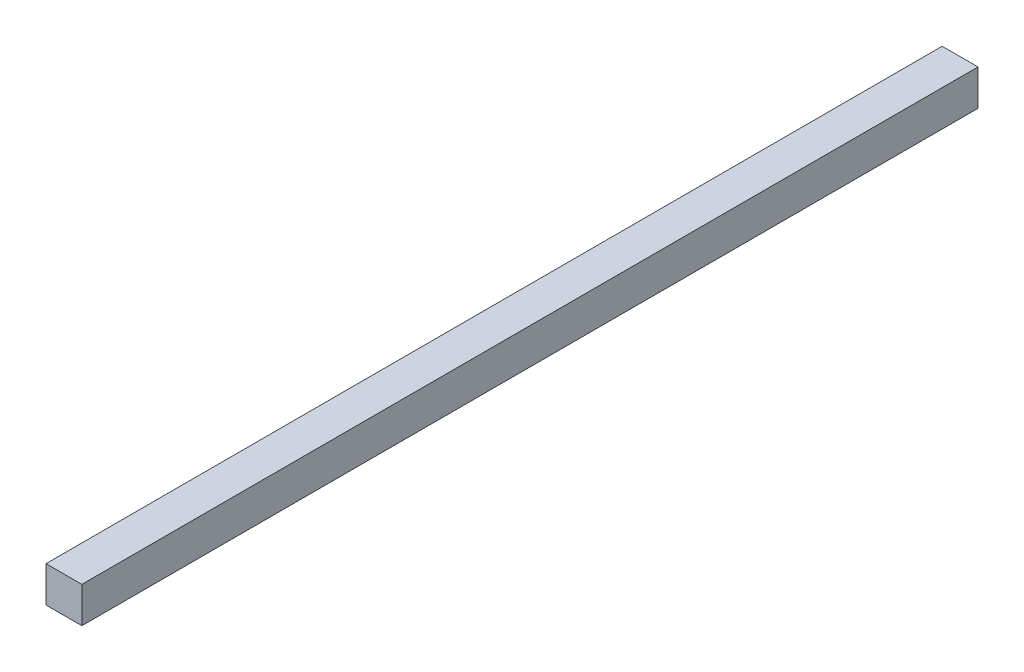
ISO-10303-21;
HEADER;
FILE_DESCRIPTION(('STEP AP214'),'2;1');
FILE_NAME('part.step','',(''),(''),'','','');
FILE_SCHEMA(('AUTOMOTIVE_DESIGN { 1 0 10303 214 1 1 1 1 }'));
ENDSEC;
DATA;
#1=APPLICATION_CONTEXT('core data for automotive mechanical design processes');
#2=APPLICATION_PROTOCOL_DEFINITION('international standard','automotive_design',2000,#1);
#3=PRODUCT_CONTEXT('',#1,'mechanical');
#4=PRODUCT('Part','Part','',(#3));
#5=PRODUCT_RELATED_PRODUCT_CATEGORY('part','',(#4));
#6=PRODUCT_DEFINITION_FORMATION('','',#4);
#7=PRODUCT_DEFINITION_CONTEXT('part definition',#1,'design');
#8=PRODUCT_DEFINITION('design','',#6,#7);
#9=PRODUCT_DEFINITION_SHAPE('','',#8);
#10=(LENGTH_UNIT() NAMED_UNIT(*) SI_UNIT(.MILLI.,.METRE.));
#11=(NAMED_UNIT(*) PLANE_ANGLE_UNIT() SI_UNIT($,.RADIAN.));
#12=(NAMED_UNIT(*) SI_UNIT($,.STERADIAN.) SOLID_ANGLE_UNIT());
#13=UNCERTAINTY_MEASURE_WITH_UNIT(LENGTH_MEASURE(1.E-05),#10,'distance_accuracy_value','');
#14=(GEOMETRIC_REPRESENTATION_CONTEXT(3) GLOBAL_UNCERTAINTY_ASSIGNED_CONTEXT((#13)) GLOBAL_UNIT_ASSIGNED_CONTEXT((#10,
#11,#12)) REPRESENTATION_CONTEXT('',''));
#15=CARTESIAN_POINT('',(0.,0.,0.));
#16=DIRECTION('',(0.,0.,1.));
#17=DIRECTION('',(1.,0.,0.));
#18=AXIS2_PLACEMENT_3D('',#15,#16,#17);
#19=CARTESIAN_POINT('',(-10.,10.,500.));
#20=DIRECTION('',(1.,0.,0.));
#21=DIRECTION('',(0.,0.,-1.));
#22=AXIS2_PLACEMENT_3D('',#19,#20,#21);
#23=PLANE('',#22);
#24=DIRECTION('',(0.,-1.,0.));
#25=VECTOR('',#24,1.);
#26=CARTESIAN_POINT('',(-10.,10.,0.));
#27=LINE('',#26,#25);
#28=CARTESIAN_POINT('',(-10.,10.,0.));
#29=VERTEX_POINT('',#28);
#30=CARTESIAN_POINT('',(-10.,-10.,0.));
#31=VERTEX_POINT('',#30);
#32=EDGE_CURVE('E95',#29,#31,#27,.T.);
#33=ORIENTED_EDGE('',*,*,#32,.T.);
#34=DIRECTION('',(0.,0.,-1.));
#35=VECTOR('',#34,1.);
#36=CARTESIAN_POINT('',(-10.,-10.,500.));
#37=LINE('',#36,#35);
#38=CARTESIAN_POINT('',(-10.,-10.,500.));
#39=VERTEX_POINT('',#38);
#40=EDGE_CURVE('E11',#39,#31,#37,.T.);
#41=ORIENTED_EDGE('',*,*,#40,.F.);
#42=DIRECTION('',(0.,-1.,0.));
#43=VECTOR('',#42,1.);
#44=CARTESIAN_POINT('',(-10.,10.,500.));
#45=LINE('',#44,#43);
#46=CARTESIAN_POINT('',(-10.,10.,500.));
#47=VERTEX_POINT('',#46);
#48=EDGE_CURVE('E83',#47,#39,#45,.T.);
#49=ORIENTED_EDGE('',*,*,#48,.F.);
#50=DIRECTION('',(0.,0.,-1.));
#51=VECTOR('',#50,1.);
#52=CARTESIAN_POINT('',(-10.,10.,500.));
#53=LINE('',#52,#51);
#54=EDGE_CURVE('E91',#47,#29,#53,.T.);
#55=ORIENTED_EDGE('',*,*,#54,.T.);
#56=EDGE_LOOP('',(#33,#41,#49,#55));
#57=FACE_BOUND('',#56,.T.);
#58=ADVANCED_FACE('F32',(#57),#23,.F.);
#59=CARTESIAN_POINT('',(-10.,-10.,500.));
#60=DIRECTION('',(0.,1.,0.));
#61=DIRECTION('',(0.,0.,1.));
#62=AXIS2_PLACEMENT_3D('',#59,#60,#61);
#63=PLANE('',#62);
#64=DIRECTION('',(1.,0.,0.));
#65=VECTOR('',#64,1.);
#66=CARTESIAN_POINT('',(-10.,-10.,0.));
#67=LINE('',#66,#65);
#68=CARTESIAN_POINT('',(10.,-10.,0.));
#69=VERTEX_POINT('',#68);
#70=EDGE_CURVE('E87',#31,#69,#67,.T.);
#71=ORIENTED_EDGE('',*,*,#70,.T.);
#72=DIRECTION('',(0.,0.,-1.));
#73=VECTOR('',#72,1.);
#74=CARTESIAN_POINT('',(10.,-10.,500.));
#75=LINE('',#74,#73);
#76=CARTESIAN_POINT('',(10.,-10.,500.));
#77=VERTEX_POINT('',#76);
#78=EDGE_CURVE('E40',#77,#69,#75,.T.);
#79=ORIENTED_EDGE('',*,*,#78,.F.);
#80=DIRECTION('',(1.,0.,0.));
#81=VECTOR('',#80,1.);
#82=CARTESIAN_POINT('',(-10.,-10.,500.));
#83=LINE('',#82,#81);
#84=EDGE_CURVE('E78',#39,#77,#83,.T.);
#85=ORIENTED_EDGE('',*,*,#84,.F.);
#86=ORIENTED_EDGE('',*,*,#40,.T.);
#87=EDGE_LOOP('',(#71,#79,#85,#86));
#88=FACE_BOUND('',#87,.T.);
#89=ADVANCED_FACE('F86',(#88),#63,.F.);
#90=CARTESIAN_POINT('',(10.,10.,500.));
#91=DIRECTION('',(-1.,0.,0.));
#92=DIRECTION('',(0.,0.,1.));
#93=AXIS2_PLACEMENT_3D('',#90,#91,#92);
#94=PLANE('',#93);
#95=DIRECTION('',(0.,1.,0.));
#96=VECTOR('',#95,1.);
#97=CARTESIAN_POINT('',(10.,10.,0.));
#98=LINE('',#97,#96);
#99=CARTESIAN_POINT('',(10.,10.,0.));
#100=VERTEX_POINT('',#99);
#101=EDGE_CURVE('E65',#69,#100,#98,.T.);
#102=ORIENTED_EDGE('',*,*,#101,.T.);
#103=DIRECTION('',(0.,0.,-1.));
#104=VECTOR('',#103,1.);
#105=CARTESIAN_POINT('',(10.,10.,500.));
#106=LINE('',#105,#104);
#107=CARTESIAN_POINT('',(10.,10.,500.));
#108=VERTEX_POINT('',#107);
#109=EDGE_CURVE('E88',#108,#100,#106,.T.);
#110=ORIENTED_EDGE('',*,*,#109,.F.);
#111=DIRECTION('',(0.,1.,0.));
#112=VECTOR('',#111,1.);
#113=CARTESIAN_POINT('',(10.,10.,500.));
#114=LINE('',#113,#112);
#115=EDGE_CURVE('E81',#77,#108,#114,.T.);
#116=ORIENTED_EDGE('',*,*,#115,.F.);
#117=ORIENTED_EDGE('',*,*,#78,.T.);
#118=EDGE_LOOP('',(#102,#110,#116,#117));
#119=FACE_BOUND('',#118,.T.);
#120=ADVANCED_FACE('F89',(#119),#94,.F.);
#121=CARTESIAN_POINT('',(-10.,10.,500.));
#122=DIRECTION('',(0.,-1.,0.));
#123=DIRECTION('',(0.,0.,-1.));
#124=AXIS2_PLACEMENT_3D('',#121,#122,#123);
#125=PLANE('',#124);
#126=DIRECTION('',(-1.,0.,0.));
#127=VECTOR('',#126,1.);
#128=CARTESIAN_POINT('',(-10.,10.,0.));
#129=LINE('',#128,#127);
#130=EDGE_CURVE('E71',#100,#29,#129,.T.);
#131=ORIENTED_EDGE('',*,*,#130,.T.);
#132=ORIENTED_EDGE('',*,*,#54,.F.);
#133=DIRECTION('',(-1.,0.,0.));
#134=VECTOR('',#133,1.);
#135=CARTESIAN_POINT('',(-10.,10.,500.));
#136=LINE('',#135,#134);
#137=EDGE_CURVE('E48',#108,#47,#136,.T.);
#138=ORIENTED_EDGE('',*,*,#137,.F.);
#139=ORIENTED_EDGE('',*,*,#109,.T.);
#140=EDGE_LOOP('',(#131,#132,#138,#139));
#141=FACE_BOUND('',#140,.T.);
#142=ADVANCED_FACE('F102',(#141),#125,.F.);
#143=CARTESIAN_POINT('',(0.,0.,500.));
#144=DIRECTION('',(0.,0.,1.));
#145=DIRECTION('',(1.,0.,0.));
#146=AXIS2_PLACEMENT_3D('',#143,#144,#145);
#147=PLANE('',#146);
#148=ORIENTED_EDGE('',*,*,#48,.T.);
#149=ORIENTED_EDGE('',*,*,#84,.T.);
#150=ORIENTED_EDGE('',*,*,#115,.T.);
#151=ORIENTED_EDGE('',*,*,#137,.T.);
#152=EDGE_LOOP('',(#148,#149,#150,#151));
#153=FACE_BOUND('',#152,.T.);
#154=ADVANCED_FACE('F79',(#153),#147,.T.);
#155=CARTESIAN_POINT('',(0.,0.,0.));
#156=DIRECTION('',(0.,0.,1.));
#157=DIRECTION('',(1.,0.,0.));
#158=AXIS2_PLACEMENT_3D('',#155,#156,#157);
#159=PLANE('',#158);
#160=ORIENTED_EDGE('',*,*,#32,.F.);
#161=ORIENTED_EDGE('',*,*,#130,.F.);
#162=ORIENTED_EDGE('',*,*,#101,.F.);
#163=ORIENTED_EDGE('',*,*,#70,.F.);
#164=EDGE_LOOP('',(#160,#161,#162,#163));
#165=FACE_BOUND('',#164,.T.);
#166=ADVANCED_FACE('F105',(#165),#159,.F.);
#167=CLOSED_SHELL('',(#58,#89,#120,#142,#154,#166));
#168=MANIFOLD_SOLID_BREP('B2',#167);
#169=ADVANCED_BREP_SHAPE_REPRESENTATION('',(#18,#168),#14);
#170=SHAPE_DEFINITION_REPRESENTATION(#9,#169);
ENDSEC;
END-ISO-10303-21;
